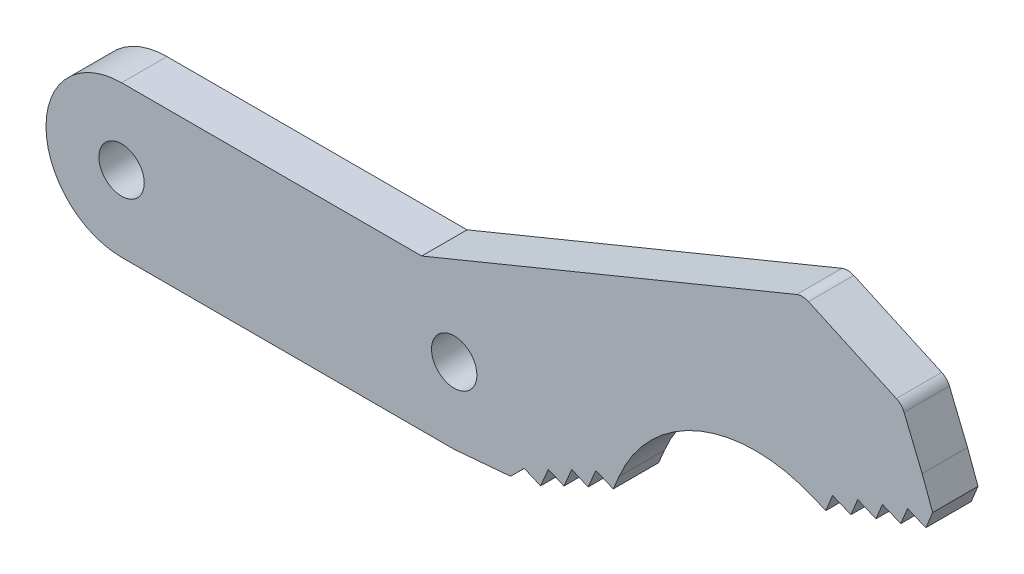
ISO-10303-21;
HEADER;
FILE_DESCRIPTION(('STEP AP214'),'2;1');
FILE_NAME('part.step','',(''),(''),'','','');
FILE_SCHEMA(('AUTOMOTIVE_DESIGN { 1 0 10303 214 1 1 1 1 }'));
ENDSEC;
DATA;
#1=APPLICATION_CONTEXT('core data for automotive mechanical design processes');
#2=APPLICATION_PROTOCOL_DEFINITION('international standard','automotive_design',2000,#1);
#3=PRODUCT_CONTEXT('',#1,'mechanical');
#4=PRODUCT('Part','Part','',(#3));
#5=PRODUCT_RELATED_PRODUCT_CATEGORY('part','',(#4));
#6=PRODUCT_DEFINITION_FORMATION('','',#4);
#7=PRODUCT_DEFINITION_CONTEXT('part definition',#1,'design');
#8=PRODUCT_DEFINITION('design','',#6,#7);
#9=PRODUCT_DEFINITION_SHAPE('','',#8);
#10=(LENGTH_UNIT() NAMED_UNIT(*) SI_UNIT(.MILLI.,.METRE.));
#11=(NAMED_UNIT(*) PLANE_ANGLE_UNIT() SI_UNIT($,.RADIAN.));
#12=(NAMED_UNIT(*) SI_UNIT($,.STERADIAN.) SOLID_ANGLE_UNIT());
#13=UNCERTAINTY_MEASURE_WITH_UNIT(LENGTH_MEASURE(1.E-05),#10,'distance_accuracy_value','');
#14=(GEOMETRIC_REPRESENTATION_CONTEXT(3) GLOBAL_UNCERTAINTY_ASSIGNED_CONTEXT((#13)) GLOBAL_UNIT_ASSIGNED_CONTEXT((#10,
#11,#12)) REPRESENTATION_CONTEXT('',''));
#15=CARTESIAN_POINT('',(0.,0.,0.));
#16=DIRECTION('',(0.,0.,1.));
#17=DIRECTION('',(1.,0.,0.));
#18=AXIS2_PLACEMENT_3D('',#15,#16,#17);
#19=CARTESIAN_POINT('',(0.,0.,3.));
#20=DIRECTION('',(0.,0.,1.));
#21=DIRECTION('',(1.,0.,0.));
#22=AXIS2_PLACEMENT_3D('',#19,#20,#21);
#23=PLANE('',#22);
#24=CARTESIAN_POINT('',(0.,0.,3.));
#25=DIRECTION('',(0.,0.,1.));
#26=DIRECTION('',(1.,0.,0.));
#27=AXIS2_PLACEMENT_3D('',#24,#25,#26);
#28=CIRCLE('',#27,1.5);
#29=CARTESIAN_POINT('',(1.5,0.,3.));
#30=VERTEX_POINT('',#29);
#31=EDGE_CURVE('E269',#30,#30,#28,.T.);
#32=ORIENTED_EDGE('',*,*,#31,.F.);
#33=EDGE_LOOP('',(#32));
#34=FACE_BOUND('',#33,.T.);
#35=CARTESIAN_POINT('',(0.,0.,3.));
#36=DIRECTION('',(0.,0.,1.));
#37=DIRECTION('',(1.,0.,0.));
#38=AXIS2_PLACEMENT_3D('',#35,#36,#37);
#39=CIRCLE('',#38,4.99999999999999);
#40=CARTESIAN_POINT('',(0.,4.99999999999997,3.));
#41=VERTEX_POINT('',#40);
#42=CARTESIAN_POINT('',(0.,-5.,3.));
#43=VERTEX_POINT('',#42);
#44=EDGE_CURVE('E324',#41,#43,#39,.T.);
#45=ORIENTED_EDGE('',*,*,#44,.T.);
#46=DIRECTION('',(1.,0.,0.));
#47=VECTOR('',#46,1.);
#48=CARTESIAN_POINT('',(0.,-5.,3.));
#49=LINE('',#48,#47);
#50=CARTESIAN_POINT('',(22.,-5.,3.));
#51=VERTEX_POINT('',#50);
#52=EDGE_CURVE('E162',#43,#51,#49,.T.);
#53=ORIENTED_EDGE('',*,*,#52,.T.);
#54=DIRECTION('',(0.996324640993903,0.0856575142551483,0.));
#55=VECTOR('',#54,1.);
#56=CARTESIAN_POINT('',(22.,-5.,3.));
#57=LINE('',#56,#55);
#58=CARTESIAN_POINT('',(25.729131342254,-4.67939353503313,3.));
#59=VERTEX_POINT('',#58);
#60=EDGE_CURVE('E405',#51,#59,#57,.T.);
#61=ORIENTED_EDGE('',*,*,#60,.T.);
#62=DIRECTION('',(0.705784062464387,0.708427030237601,0.));
#63=VECTOR('',#62,1.);
#64=CARTESIAN_POINT('',(26.629072935784,-3.77608190701817,3.));
#65=LINE('',#64,#63);
#66=CARTESIAN_POINT('',(26.629072935784,-3.77608190701817,3.));
#67=VERTEX_POINT('',#66);
#68=EDGE_CURVE('E424',#59,#67,#65,.T.);
#69=ORIENTED_EDGE('',*,*,#68,.T.);
#70=DIRECTION('',(0.920231847365872,-0.391373666837198,0.));
#71=VECTOR('',#70,1.);
#72=CARTESIAN_POINT('',(27.7149465156757,-4.23790283388607,3.));
#73=LINE('',#72,#71);
#74=CARTESIAN_POINT('',(27.7149465156757,-4.23790283388607,3.));
#75=VERTEX_POINT('',#74);
#76=EDGE_CURVE('E421',#67,#75,#73,.T.);
#77=ORIENTED_EDGE('',*,*,#76,.T.);
#78=DIRECTION('',(0.391373666837287,0.920231847365834,0.));
#79=VECTOR('',#78,1.);
#80=CARTESIAN_POINT('',(28.2279135207181,-3.03177014104923,3.));
#81=LINE('',#80,#79);
#82=CARTESIAN_POINT('',(28.2279135207181,-3.03177014104923,3.));
#83=VERTEX_POINT('',#82);
#84=EDGE_CURVE('E423',#75,#83,#81,.T.);
#85=ORIENTED_EDGE('',*,*,#84,.T.);
#86=DIRECTION('',(0.920231847365872,-0.391373666837198,0.));
#87=VECTOR('',#86,1.);
#88=CARTESIAN_POINT('',(29.2618659759202,-3.47150906650168,3.));
#89=LINE('',#88,#87);
#90=CARTESIAN_POINT('',(29.2618659759202,-3.47150906650168,3.));
#91=VERTEX_POINT('',#90);
#92=EDGE_CURVE('E426',#83,#91,#89,.T.);
#93=ORIENTED_EDGE('',*,*,#92,.T.);
#94=DIRECTION('',(0.391373666837196,0.920231847365873,0.));
#95=VECTOR('',#94,1.);
#96=CARTESIAN_POINT('',(29.7748329809625,-2.26537637366479,3.));
#97=LINE('',#96,#95);
#98=CARTESIAN_POINT('',(29.7748329809625,-2.26537637366479,3.));
#99=VERTEX_POINT('',#98);
#100=EDGE_CURVE('E432',#91,#99,#97,.T.);
#101=ORIENTED_EDGE('',*,*,#100,.T.);
#102=DIRECTION('',(0.920231847365872,-0.391373666837198,0.));
#103=VECTOR('',#102,1.);
#104=CARTESIAN_POINT('',(30.8607065608543,-2.72719730053268,3.));
#105=LINE('',#104,#103);
#106=CARTESIAN_POINT('',(30.8607065608543,-2.72719730053268,3.));
#107=VERTEX_POINT('',#106);
#108=EDGE_CURVE('E434',#99,#107,#105,.T.);
#109=ORIENTED_EDGE('',*,*,#108,.T.);
#110=DIRECTION('',(0.391373666837199,0.920231847365872,0.));
#111=VECTOR('',#110,1.);
#112=CARTESIAN_POINT('',(31.3736735658965,-1.52106460769579,3.));
#113=LINE('',#112,#111);
#114=CARTESIAN_POINT('',(31.3736735658965,-1.52106460769579,3.));
#115=VERTEX_POINT('',#114);
#116=EDGE_CURVE('E436',#107,#115,#113,.T.);
#117=ORIENTED_EDGE('',*,*,#116,.T.);
#118=DIRECTION('',(0.920231847365872,-0.391373666837197,0.));
#119=VECTOR('',#118,1.);
#120=CARTESIAN_POINT('',(32.5211185047678,-2.0090717707877,3.));
#121=LINE('',#120,#119);
#122=CARTESIAN_POINT('',(32.5211185047678,-2.0090717707877,3.));
#123=VERTEX_POINT('',#122);
#124=EDGE_CURVE('E438',#115,#123,#121,.T.);
#125=ORIENTED_EDGE('',*,*,#124,.T.);
#126=DIRECTION('',(0.391373666837194,0.920231847365874,0.));
#127=VECTOR('',#126,1.);
#128=CARTESIAN_POINT('',(32.5211185047678,-2.0090717707877,3.));
#129=LINE('',#128,#127);
#130=CARTESIAN_POINT('',(32.9075332749706,-1.10049971302301,3.));
#131=VERTEX_POINT('',#130);
#132=EDGE_CURVE('E440',#123,#131,#129,.T.);
#133=ORIENTED_EDGE('',*,*,#132,.T.);
#134=CARTESIAN_POINT('',(41.9365668236408,-4.9053841223708,3.));
#135=DIRECTION('',(0.,0.,-1.));
#136=DIRECTION('',(1.,0.,0.));
#137=AXIS2_PLACEMENT_3D('',#134,#135,#136);
#138=CIRCLE('',#137,9.79798919123255);
#139=CARTESIAN_POINT('',(45.7368226475957,4.12559854088391,3.));
#140=VERTEX_POINT('',#139);
#141=EDGE_CURVE('E442',#131,#140,#138,.T.);
#142=ORIENTED_EDGE('',*,*,#141,.T.);
#143=DIRECTION('',(0.925474403270303,-0.378810148876026,0.));
#144=VECTOR('',#143,1.);
#145=CARTESIAN_POINT('',(46.5817909078896,3.77974072855935,3.));
#146=LINE('',#145,#144);
#147=CARTESIAN_POINT('',(46.5817909078896,3.77974072855935,3.));
#148=VERTEX_POINT('',#147);
#149=EDGE_CURVE('E444',#140,#148,#146,.T.);
#150=ORIENTED_EDGE('',*,*,#149,.T.);
#151=DIRECTION('',(0.378810148876023,0.925474403270304,0.));
#152=VECTOR('',#151,1.);
#153=CARTESIAN_POINT('',(46.5817909078896,3.77974072855935,3.));
#154=LINE('',#153,#152);
#155=CARTESIAN_POINT('',(47.0287868835633,4.87180052441831,3.));
#156=VERTEX_POINT('',#155);
#157=EDGE_CURVE('E446',#148,#156,#154,.T.);
#158=ORIENTED_EDGE('',*,*,#157,.T.);
#159=DIRECTION('',(0.925474403270304,-0.378810148876023,0.));
#160=VECTOR('',#159,1.);
#161=CARTESIAN_POINT('',(47.0287868835633,4.87180052441831,3.));
#162=LINE('',#161,#160);
#163=CARTESIAN_POINT('',(48.2417909078896,4.37530031499215,3.));
#164=VERTEX_POINT('',#163);
#165=EDGE_CURVE('E448',#156,#164,#162,.T.);
#166=ORIENTED_EDGE('',*,*,#165,.T.);
#167=DIRECTION('',(0.378810148876023,0.925474403270304,0.));
#168=VECTOR('',#167,1.);
#169=CARTESIAN_POINT('',(48.2417909078896,4.37530031499215,3.));
#170=LINE('',#169,#168);
#171=CARTESIAN_POINT('',(48.6887868835633,5.4673601108511,3.));
#172=VERTEX_POINT('',#171);
#173=EDGE_CURVE('E450',#164,#172,#170,.T.);
#174=ORIENTED_EDGE('',*,*,#173,.T.);
#175=DIRECTION('',(0.925474403270304,-0.378810148876022,0.));
#176=VECTOR('',#175,1.);
#177=CARTESIAN_POINT('',(48.6887868835633,5.4673601108511,3.));
#178=LINE('',#177,#176);
#179=CARTESIAN_POINT('',(49.9017909078896,4.97085990142494,3.));
#180=VERTEX_POINT('',#179);
#181=EDGE_CURVE('E452',#172,#180,#178,.T.);
#182=ORIENTED_EDGE('',*,*,#181,.T.);
#183=DIRECTION('',(0.378810148876024,0.925474403270304,0.));
#184=VECTOR('',#183,1.);
#185=CARTESIAN_POINT('',(49.9017909078896,4.97085990142494,3.));
#186=LINE('',#185,#184);
#187=CARTESIAN_POINT('',(50.3274137382742,6.01070277822521,3.));
#188=VERTEX_POINT('',#187);
#189=EDGE_CURVE('E454',#180,#188,#186,.T.);
#190=ORIENTED_EDGE('',*,*,#189,.T.);
#191=DIRECTION('',(0.925474403270315,-0.378810148875997,0.));
#192=VECTOR('',#191,1.);
#193=CARTESIAN_POINT('',(50.3274137382742,6.01070277822521,3.));
#194=LINE('',#193,#192);
#195=CARTESIAN_POINT('',(51.5404177626005,5.51420256879908,3.));
#196=VERTEX_POINT('',#195);
#197=EDGE_CURVE('E456',#188,#196,#194,.T.);
#198=ORIENTED_EDGE('',*,*,#197,.T.);
#199=DIRECTION('',(0.378810148876024,0.925474403270304,0.));
#200=VECTOR('',#199,1.);
#201=CARTESIAN_POINT('',(51.5404177626005,5.51420256879908,3.));
#202=LINE('',#201,#200);
#203=CARTESIAN_POINT('',(51.9874137382742,6.60626236465803,3.));
#204=VERTEX_POINT('',#203);
#205=EDGE_CURVE('E458',#196,#204,#202,.T.);
#206=ORIENTED_EDGE('',*,*,#205,.T.);
#207=DIRECTION('',(0.925474403270325,-0.378810148875973,0.));
#208=VECTOR('',#207,1.);
#209=CARTESIAN_POINT('',(51.9874137382742,6.60626236465803,3.));
#210=LINE('',#209,#208);
#211=CARTESIAN_POINT('',(53.2004177626005,6.10976215523194,3.));
#212=VERTEX_POINT('',#211);
#213=EDGE_CURVE('E460',#204,#212,#210,.T.);
#214=ORIENTED_EDGE('',*,*,#213,.T.);
#215=DIRECTION('',(0.378810148875981,0.925474403270321,0.));
#216=VECTOR('',#215,1.);
#217=CARTESIAN_POINT('',(53.2004177626005,6.10976215523194,3.));
#218=LINE('',#217,#216);
#219=CARTESIAN_POINT('',(53.6474137382742,7.20182195109092,3.));
#220=VERTEX_POINT('',#219);
#221=EDGE_CURVE('E462',#212,#220,#218,.T.);
#222=ORIENTED_EDGE('',*,*,#221,.T.);
#223=DIRECTION('',(-0.344909177439844,0.938636063294912,0.));
#224=VECTOR('',#223,1.);
#225=CARTESIAN_POINT('',(53.6474137382742,7.20182195109092,3.));
#226=LINE('',#225,#224);
#227=CARTESIAN_POINT('',(52.954960556224,9.08626449808284,3.));
#228=VERTEX_POINT('',#227);
#229=EDGE_CURVE('E464',#220,#228,#226,.T.);
#230=ORIENTED_EDGE('',*,*,#229,.T.);
#231=DIRECTION('',(-0.380263412733203,0.924878228166551,0.));
#232=VECTOR('',#231,1.);
#233=CARTESIAN_POINT('',(51.7554288533698,12.0037704132359,3.));
#234=LINE('',#233,#232);
#235=CARTESIAN_POINT('',(51.7554288533698,12.0037704132359,3.));
#236=VERTEX_POINT('',#235);
#237=EDGE_CURVE('E466',#228,#236,#234,.T.);
#238=ORIENTED_EDGE('',*,*,#237,.T.);
#239=CARTESIAN_POINT('',(50.8305506252032,11.6235070005027,3.));
#240=DIRECTION('',(0.,0.,1.));
#241=DIRECTION('',(-1.,0.,0.));
#242=AXIS2_PLACEMENT_3D('',#239,#240,#241);
#243=CIRCLE('',#242,1.);
#244=CARTESIAN_POINT('',(51.2450850433417,12.5335406351441,3.));
#245=VERTEX_POINT('',#244);
#246=EDGE_CURVE('E468',#236,#245,#243,.T.);
#247=ORIENTED_EDGE('',*,*,#246,.T.);
#248=DIRECTION('',(-0.910033634641374,0.414534418138482,0.));
#249=VECTOR('',#248,1.);
#250=CARTESIAN_POINT('',(45.4378668595606,15.1788184789301,3.));
#251=LINE('',#250,#249);
#252=CARTESIAN_POINT('',(45.4378668595606,15.1788184789301,3.));
#253=VERTEX_POINT('',#252);
#254=EDGE_CURVE('E247',#245,#253,#251,.T.);
#255=ORIENTED_EDGE('',*,*,#254,.T.);
#256=CARTESIAN_POINT('',(45.0233324414221,14.2687848442887,3.));
#257=DIRECTION('',(0.,0.,1.));
#258=DIRECTION('',(-1.,0.,0.));
#259=AXIS2_PLACEMENT_3D('',#256,#257,#258);
#260=CIRCLE('',#259,1.);
#261=CARTESIAN_POINT('',(44.6430690286889,15.1936630724553,3.));
#262=VERTEX_POINT('',#261);
#263=EDGE_CURVE('E241',#253,#262,#260,.T.);
#264=ORIENTED_EDGE('',*,*,#263,.T.);
#265=DIRECTION('',(-0.924878228166549,-0.380263412733206,0.));
#266=VECTOR('',#265,1.);
#267=CARTESIAN_POINT('',(19.85,5.,3.));
#268=LINE('',#267,#266);
#269=CARTESIAN_POINT('',(19.85,5.,3.));
#270=VERTEX_POINT('',#269);
#271=EDGE_CURVE('E245',#262,#270,#268,.T.);
#272=ORIENTED_EDGE('',*,*,#271,.T.);
#273=DIRECTION('',(-1.,0.,0.));
#274=VECTOR('',#273,1.);
#275=CARTESIAN_POINT('',(0.,4.99999999999997,3.));
#276=LINE('',#275,#274);
#277=EDGE_CURVE('E53',#270,#41,#276,.T.);
#278=ORIENTED_EDGE('',*,*,#277,.T.);
#279=EDGE_LOOP('',(#45,#53,#61,#69,#77,#85,#93,#101,#109,#117,#125,#133,#142,#150,#158,#166,
#174,#182,#190,#198,#206,#214,#222,#230,#238,#247,#255,#264,#272,#278));
#280=FACE_BOUND('',#279,.T.);
#281=CARTESIAN_POINT('',(22.,0.,3.));
#282=DIRECTION('',(0.,0.,1.));
#283=DIRECTION('',(1.,0.,0.));
#284=AXIS2_PLACEMENT_3D('',#281,#282,#283);
#285=CIRCLE('',#284,1.5);
#286=CARTESIAN_POINT('',(23.5,0.,3.));
#287=VERTEX_POINT('',#286);
#288=EDGE_CURVE('E510',#287,#287,#285,.T.);
#289=ORIENTED_EDGE('',*,*,#288,.F.);
#290=EDGE_LOOP('',(#289));
#291=FACE_BOUND('',#290,.T.);
#292=ADVANCED_FACE('F36',(#34,#280,#291),#23,.T.);
#293=CARTESIAN_POINT('',(0.,0.,0.));
#294=DIRECTION('',(0.,0.,1.));
#295=DIRECTION('',(1.,0.,0.));
#296=AXIS2_PLACEMENT_3D('',#293,#294,#295);
#297=PLANE('',#296);
#298=CARTESIAN_POINT('',(0.,0.,0.));
#299=DIRECTION('',(0.,0.,1.));
#300=DIRECTION('',(1.,0.,0.));
#301=AXIS2_PLACEMENT_3D('',#298,#299,#300);
#302=CIRCLE('',#301,4.99999999999999);
#303=CARTESIAN_POINT('',(0.,4.99999999999997,0.));
#304=VERTEX_POINT('',#303);
#305=CARTESIAN_POINT('',(0.,-5.,0.));
#306=VERTEX_POINT('',#305);
#307=EDGE_CURVE('E265',#304,#306,#302,.T.);
#308=ORIENTED_EDGE('',*,*,#307,.F.);
#309=DIRECTION('',(-1.,0.,0.));
#310=VECTOR('',#309,1.);
#311=CARTESIAN_POINT('',(0.,4.99999999999997,0.));
#312=LINE('',#311,#310);
#313=CARTESIAN_POINT('',(19.85,5.,0.));
#314=VERTEX_POINT('',#313);
#315=EDGE_CURVE('E154',#314,#304,#312,.T.);
#316=ORIENTED_EDGE('',*,*,#315,.F.);
#317=DIRECTION('',(-0.924878228166549,-0.380263412733206,0.));
#318=VECTOR('',#317,1.);
#319=CARTESIAN_POINT('',(19.85,5.,0.));
#320=LINE('',#319,#318);
#321=CARTESIAN_POINT('',(44.6430690286889,15.1936630724553,0.));
#322=VERTEX_POINT('',#321);
#323=EDGE_CURVE('E148',#322,#314,#320,.T.);
#324=ORIENTED_EDGE('',*,*,#323,.F.);
#325=CARTESIAN_POINT('',(45.0233324414221,14.2687848442887,0.));
#326=DIRECTION('',(0.,0.,1.));
#327=DIRECTION('',(-1.,0.,0.));
#328=AXIS2_PLACEMENT_3D('',#325,#326,#327);
#329=CIRCLE('',#328,1.);
#330=CARTESIAN_POINT('',(45.4378668595606,15.1788184789301,0.));
#331=VERTEX_POINT('',#330);
#332=EDGE_CURVE('E255',#331,#322,#329,.T.);
#333=ORIENTED_EDGE('',*,*,#332,.F.);
#334=DIRECTION('',(-0.910033634641374,0.414534418138482,0.));
#335=VECTOR('',#334,1.);
#336=CARTESIAN_POINT('',(45.4378668595606,15.1788184789301,0.));
#337=LINE('',#336,#335);
#338=CARTESIAN_POINT('',(51.2450850433417,12.5335406351441,0.));
#339=VERTEX_POINT('',#338);
#340=EDGE_CURVE('E319',#339,#331,#337,.T.);
#341=ORIENTED_EDGE('',*,*,#340,.F.);
#342=CARTESIAN_POINT('',(50.8305506252032,11.6235070005027,0.));
#343=DIRECTION('',(0.,0.,1.));
#344=DIRECTION('',(-1.,0.,0.));
#345=AXIS2_PLACEMENT_3D('',#342,#343,#344);
#346=CIRCLE('',#345,1.);
#347=CARTESIAN_POINT('',(51.7554288533698,12.0037704132359,0.));
#348=VERTEX_POINT('',#347);
#349=EDGE_CURVE('E317',#348,#339,#346,.T.);
#350=ORIENTED_EDGE('',*,*,#349,.F.);
#351=DIRECTION('',(-0.380263412733203,0.924878228166551,0.));
#352=VECTOR('',#351,1.);
#353=CARTESIAN_POINT('',(51.7554288533698,12.0037704132359,0.));
#354=LINE('',#353,#352);
#355=CARTESIAN_POINT('',(52.954960556224,9.08626449808284,0.));
#356=VERTEX_POINT('',#355);
#357=EDGE_CURVE('E315',#356,#348,#354,.T.);
#358=ORIENTED_EDGE('',*,*,#357,.F.);
#359=DIRECTION('',(-0.344909177439844,0.938636063294912,0.));
#360=VECTOR('',#359,1.);
#361=CARTESIAN_POINT('',(53.6474137382742,7.20182195109092,0.));
#362=LINE('',#361,#360);
#363=CARTESIAN_POINT('',(53.6474137382742,7.20182195109092,0.));
#364=VERTEX_POINT('',#363);
#365=EDGE_CURVE('E313',#364,#356,#362,.T.);
#366=ORIENTED_EDGE('',*,*,#365,.F.);
#367=DIRECTION('',(0.378810148875981,0.925474403270321,0.));
#368=VECTOR('',#367,1.);
#369=CARTESIAN_POINT('',(53.2004177626005,6.10976215523194,0.));
#370=LINE('',#369,#368);
#371=CARTESIAN_POINT('',(53.2004177626005,6.10976215523194,0.));
#372=VERTEX_POINT('',#371);
#373=EDGE_CURVE('E311',#372,#364,#370,.T.);
#374=ORIENTED_EDGE('',*,*,#373,.F.);
#375=DIRECTION('',(0.925474403270325,-0.378810148875973,0.));
#376=VECTOR('',#375,1.);
#377=CARTESIAN_POINT('',(51.9874137382742,6.60626236465803,0.));
#378=LINE('',#377,#376);
#379=CARTESIAN_POINT('',(51.9874137382742,6.60626236465803,0.));
#380=VERTEX_POINT('',#379);
#381=EDGE_CURVE('E309',#380,#372,#378,.T.);
#382=ORIENTED_EDGE('',*,*,#381,.F.);
#383=DIRECTION('',(0.378810148876024,0.925474403270304,0.));
#384=VECTOR('',#383,1.);
#385=CARTESIAN_POINT('',(51.5404177626005,5.51420256879908,0.));
#386=LINE('',#385,#384);
#387=CARTESIAN_POINT('',(51.5404177626005,5.51420256879908,0.));
#388=VERTEX_POINT('',#387);
#389=EDGE_CURVE('E307',#388,#380,#386,.T.);
#390=ORIENTED_EDGE('',*,*,#389,.F.);
#391=DIRECTION('',(0.925474403270315,-0.378810148875997,0.));
#392=VECTOR('',#391,1.);
#393=CARTESIAN_POINT('',(50.3274137382742,6.01070277822521,0.));
#394=LINE('',#393,#392);
#395=CARTESIAN_POINT('',(50.3274137382742,6.01070277822521,0.));
#396=VERTEX_POINT('',#395);
#397=EDGE_CURVE('E305',#396,#388,#394,.T.);
#398=ORIENTED_EDGE('',*,*,#397,.F.);
#399=DIRECTION('',(0.378810148876024,0.925474403270304,0.));
#400=VECTOR('',#399,1.);
#401=CARTESIAN_POINT('',(49.9017909078896,4.97085990142494,0.));
#402=LINE('',#401,#400);
#403=CARTESIAN_POINT('',(49.9017909078896,4.97085990142494,0.));
#404=VERTEX_POINT('',#403);
#405=EDGE_CURVE('E303',#404,#396,#402,.T.);
#406=ORIENTED_EDGE('',*,*,#405,.F.);
#407=DIRECTION('',(0.925474403270304,-0.378810148876022,0.));
#408=VECTOR('',#407,1.);
#409=CARTESIAN_POINT('',(48.6887868835633,5.4673601108511,0.));
#410=LINE('',#409,#408);
#411=CARTESIAN_POINT('',(48.6887868835633,5.4673601108511,0.));
#412=VERTEX_POINT('',#411);
#413=EDGE_CURVE('E301',#412,#404,#410,.T.);
#414=ORIENTED_EDGE('',*,*,#413,.F.);
#415=DIRECTION('',(0.378810148876023,0.925474403270304,0.));
#416=VECTOR('',#415,1.);
#417=CARTESIAN_POINT('',(48.2417909078896,4.37530031499215,0.));
#418=LINE('',#417,#416);
#419=CARTESIAN_POINT('',(48.2417909078896,4.37530031499215,0.));
#420=VERTEX_POINT('',#419);
#421=EDGE_CURVE('E299',#420,#412,#418,.T.);
#422=ORIENTED_EDGE('',*,*,#421,.F.);
#423=DIRECTION('',(0.925474403270304,-0.378810148876023,0.));
#424=VECTOR('',#423,1.);
#425=CARTESIAN_POINT('',(47.0287868835633,4.87180052441831,0.));
#426=LINE('',#425,#424);
#427=CARTESIAN_POINT('',(47.0287868835633,4.87180052441831,0.));
#428=VERTEX_POINT('',#427);
#429=EDGE_CURVE('E297',#428,#420,#426,.T.);
#430=ORIENTED_EDGE('',*,*,#429,.F.);
#431=DIRECTION('',(0.378810148876023,0.925474403270304,0.));
#432=VECTOR('',#431,1.);
#433=CARTESIAN_POINT('',(46.5817909078896,3.77974072855935,0.));
#434=LINE('',#433,#432);
#435=CARTESIAN_POINT('',(46.5817909078896,3.77974072855935,0.));
#436=VERTEX_POINT('',#435);
#437=EDGE_CURVE('E295',#436,#428,#434,.T.);
#438=ORIENTED_EDGE('',*,*,#437,.F.);
#439=DIRECTION('',(0.925474403270303,-0.378810148876026,0.));
#440=VECTOR('',#439,1.);
#441=CARTESIAN_POINT('',(46.5817909078896,3.77974072855935,0.));
#442=LINE('',#441,#440);
#443=CARTESIAN_POINT('',(45.7368226475957,4.12559854088391,0.));
#444=VERTEX_POINT('',#443);
#445=EDGE_CURVE('E293',#444,#436,#442,.T.);
#446=ORIENTED_EDGE('',*,*,#445,.F.);
#447=CARTESIAN_POINT('',(41.9365668236408,-4.9053841223708,0.));
#448=DIRECTION('',(0.,0.,-1.));
#449=DIRECTION('',(1.,0.,0.));
#450=AXIS2_PLACEMENT_3D('',#447,#448,#449);
#451=CIRCLE('',#450,9.79798919123255);
#452=CARTESIAN_POINT('',(32.9075332749706,-1.10049971302301,0.));
#453=VERTEX_POINT('',#452);
#454=EDGE_CURVE('E291',#453,#444,#451,.T.);
#455=ORIENTED_EDGE('',*,*,#454,.F.);
#456=DIRECTION('',(0.391373666837194,0.920231847365874,0.));
#457=VECTOR('',#456,1.);
#458=CARTESIAN_POINT('',(32.5211185047678,-2.0090717707877,0.));
#459=LINE('',#458,#457);
#460=CARTESIAN_POINT('',(32.5211185047678,-2.0090717707877,0.));
#461=VERTEX_POINT('',#460);
#462=EDGE_CURVE('E289',#461,#453,#459,.T.);
#463=ORIENTED_EDGE('',*,*,#462,.F.);
#464=DIRECTION('',(0.920231847365872,-0.391373666837197,0.));
#465=VECTOR('',#464,1.);
#466=CARTESIAN_POINT('',(32.5211185047678,-2.0090717707877,0.));
#467=LINE('',#466,#465);
#468=CARTESIAN_POINT('',(31.3736735658965,-1.52106460769579,0.));
#469=VERTEX_POINT('',#468);
#470=EDGE_CURVE('E287',#469,#461,#467,.T.);
#471=ORIENTED_EDGE('',*,*,#470,.F.);
#472=DIRECTION('',(0.391373666837199,0.920231847365872,0.));
#473=VECTOR('',#472,1.);
#474=CARTESIAN_POINT('',(31.3736735658965,-1.52106460769579,0.));
#475=LINE('',#474,#473);
#476=CARTESIAN_POINT('',(30.8607065608543,-2.72719730053268,0.));
#477=VERTEX_POINT('',#476);
#478=EDGE_CURVE('E285',#477,#469,#475,.T.);
#479=ORIENTED_EDGE('',*,*,#478,.F.);
#480=DIRECTION('',(0.920231847365872,-0.391373666837198,0.));
#481=VECTOR('',#480,1.);
#482=CARTESIAN_POINT('',(30.8607065608543,-2.72719730053268,0.));
#483=LINE('',#482,#481);
#484=CARTESIAN_POINT('',(29.7748329809625,-2.26537637366479,0.));
#485=VERTEX_POINT('',#484);
#486=EDGE_CURVE('E283',#485,#477,#483,.T.);
#487=ORIENTED_EDGE('',*,*,#486,.F.);
#488=DIRECTION('',(0.391373666837196,0.920231847365873,0.));
#489=VECTOR('',#488,1.);
#490=CARTESIAN_POINT('',(29.7748329809625,-2.26537637366479,0.));
#491=LINE('',#490,#489);
#492=CARTESIAN_POINT('',(29.2618659759202,-3.47150906650168,0.));
#493=VERTEX_POINT('',#492);
#494=EDGE_CURVE('E281',#493,#485,#491,.T.);
#495=ORIENTED_EDGE('',*,*,#494,.F.);
#496=DIRECTION('',(0.920231847365872,-0.391373666837198,0.));
#497=VECTOR('',#496,1.);
#498=CARTESIAN_POINT('',(29.2618659759202,-3.47150906650168,0.));
#499=LINE('',#498,#497);
#500=CARTESIAN_POINT('',(28.2279135207181,-3.03177014104923,0.));
#501=VERTEX_POINT('',#500);
#502=EDGE_CURVE('E279',#501,#493,#499,.T.);
#503=ORIENTED_EDGE('',*,*,#502,.F.);
#504=DIRECTION('',(0.391373666837287,0.920231847365834,0.));
#505=VECTOR('',#504,1.);
#506=CARTESIAN_POINT('',(28.2279135207181,-3.03177014104923,0.));
#507=LINE('',#506,#505);
#508=CARTESIAN_POINT('',(27.7149465156757,-4.23790283388607,0.));
#509=VERTEX_POINT('',#508);
#510=EDGE_CURVE('E277',#509,#501,#507,.T.);
#511=ORIENTED_EDGE('',*,*,#510,.F.);
#512=DIRECTION('',(0.920231847365872,-0.391373666837198,0.));
#513=VECTOR('',#512,1.);
#514=CARTESIAN_POINT('',(27.7149465156757,-4.23790283388607,0.));
#515=LINE('',#514,#513);
#516=CARTESIAN_POINT('',(26.629072935784,-3.77608190701817,0.));
#517=VERTEX_POINT('',#516);
#518=EDGE_CURVE('E275',#517,#509,#515,.T.);
#519=ORIENTED_EDGE('',*,*,#518,.F.);
#520=DIRECTION('',(0.705784062464387,0.708427030237601,0.));
#521=VECTOR('',#520,1.);
#522=CARTESIAN_POINT('',(26.629072935784,-3.77608190701817,0.));
#523=LINE('',#522,#521);
#524=CARTESIAN_POINT('',(25.729131342254,-4.67939353503313,0.));
#525=VERTEX_POINT('',#524);
#526=EDGE_CURVE('E273',#525,#517,#523,.T.);
#527=ORIENTED_EDGE('',*,*,#526,.F.);
#528=DIRECTION('',(0.996324640993903,0.0856575142551483,0.));
#529=VECTOR('',#528,1.);
#530=CARTESIAN_POINT('',(22.,-5.,0.));
#531=LINE('',#530,#529);
#532=CARTESIAN_POINT('',(22.,-5.,0.));
#533=VERTEX_POINT('',#532);
#534=EDGE_CURVE('E271',#533,#525,#531,.T.);
#535=ORIENTED_EDGE('',*,*,#534,.F.);
#536=DIRECTION('',(1.,0.,0.));
#537=VECTOR('',#536,1.);
#538=CARTESIAN_POINT('',(0.,-5.,0.));
#539=LINE('',#538,#537);
#540=EDGE_CURVE('E268',#306,#533,#539,.T.);
#541=ORIENTED_EDGE('',*,*,#540,.F.);
#542=EDGE_LOOP('',(#308,#316,#324,#333,#341,#350,#358,#366,#374,#382,#390,#398,#406,#414,#422,
#430,#438,#446,#455,#463,#471,#479,#487,#495,#503,#511,#519,#527,#535,#541));
#543=FACE_BOUND('',#542,.T.);
#544=CARTESIAN_POINT('',(0.,0.,0.));
#545=DIRECTION('',(0.,0.,1.));
#546=DIRECTION('',(1.,0.,0.));
#547=AXIS2_PLACEMENT_3D('',#544,#545,#546);
#548=CIRCLE('',#547,1.5);
#549=CARTESIAN_POINT('',(1.5,0.,0.));
#550=VERTEX_POINT('',#549);
#551=EDGE_CURVE('E516',#550,#550,#548,.T.);
#552=ORIENTED_EDGE('',*,*,#551,.T.);
#553=EDGE_LOOP('',(#552));
#554=FACE_BOUND('',#553,.T.);
#555=CARTESIAN_POINT('',(22.,0.,0.));
#556=DIRECTION('',(0.,0.,1.));
#557=DIRECTION('',(1.,0.,0.));
#558=AXIS2_PLACEMENT_3D('',#555,#556,#557);
#559=CIRCLE('',#558,1.5);
#560=CARTESIAN_POINT('',(23.5,0.,0.));
#561=VERTEX_POINT('',#560);
#562=EDGE_CURVE('E513',#561,#561,#559,.T.);
#563=ORIENTED_EDGE('',*,*,#562,.T.);
#564=EDGE_LOOP('',(#563));
#565=FACE_BOUND('',#564,.T.);
#566=ADVANCED_FACE('F409',(#543,#554,#565),#297,.F.);
#567=CARTESIAN_POINT('',(0.,0.,3.));
#568=DIRECTION('',(0.,0.,-1.));
#569=DIRECTION('',(-1.,0.,0.));
#570=AXIS2_PLACEMENT_3D('',#567,#568,#569);
#571=CYLINDRICAL_SURFACE('',#570,4.99999999999999);
#572=ORIENTED_EDGE('',*,*,#307,.T.);
#573=DIRECTION('',(0.,0.,-1.));
#574=VECTOR('',#573,1.);
#575=CARTESIAN_POINT('',(0.,-5.,3.));
#576=LINE('',#575,#574);
#577=EDGE_CURVE('E11',#43,#306,#576,.T.);
#578=ORIENTED_EDGE('',*,*,#577,.F.);
#579=ORIENTED_EDGE('',*,*,#44,.F.);
#580=DIRECTION('',(0.,0.,-1.));
#581=VECTOR('',#580,1.);
#582=CARTESIAN_POINT('',(0.,4.99999999999997,3.));
#583=LINE('',#582,#581);
#584=EDGE_CURVE('E261',#41,#304,#583,.T.);
#585=ORIENTED_EDGE('',*,*,#584,.T.);
#586=EDGE_LOOP('',(#572,#578,#579,#585));
#587=FACE_BOUND('',#586,.T.);
#588=ADVANCED_FACE('F38',(#587),#571,.T.);
#589=CARTESIAN_POINT('',(0.,-5.,3.));
#590=DIRECTION('',(0.,1.,0.));
#591=DIRECTION('',(-1.,0.,0.));
#592=AXIS2_PLACEMENT_3D('',#589,#590,#591);
#593=PLANE('',#592);
#594=ORIENTED_EDGE('',*,*,#540,.T.);
#595=DIRECTION('',(0.,0.,-1.));
#596=VECTOR('',#595,1.);
#597=CARTESIAN_POINT('',(22.,-5.,3.));
#598=LINE('',#597,#596);
#599=EDGE_CURVE('E45',#51,#533,#598,.T.);
#600=ORIENTED_EDGE('',*,*,#599,.F.);
#601=ORIENTED_EDGE('',*,*,#52,.F.);
#602=ORIENTED_EDGE('',*,*,#577,.T.);
#603=EDGE_LOOP('',(#594,#600,#601,#602));
#604=FACE_BOUND('',#603,.T.);
#605=ADVANCED_FACE('F789',(#604),#593,.F.);
#606=CARTESIAN_POINT('',(22.,-5.,3.));
#607=DIRECTION('',(-0.0856575142551483,0.996324640993903,0.));
#608=DIRECTION('',(-0.996324640993903,-0.0856575142551483,0.));
#609=AXIS2_PLACEMENT_3D('',#606,#607,#608);
#610=PLANE('',#609);
#611=ORIENTED_EDGE('',*,*,#534,.T.);
#612=DIRECTION('',(0.,0.,-1.));
#613=VECTOR('',#612,1.);
#614=CARTESIAN_POINT('',(25.729131342254,-4.67939353503313,3.));
#615=LINE('',#614,#613);
#616=EDGE_CURVE('E397',#59,#525,#615,.T.);
#617=ORIENTED_EDGE('',*,*,#616,.F.);
#618=ORIENTED_EDGE('',*,*,#60,.F.);
#619=ORIENTED_EDGE('',*,*,#599,.T.);
#620=EDGE_LOOP('',(#611,#617,#618,#619));
#621=FACE_BOUND('',#620,.T.);
#622=ADVANCED_FACE('F403',(#621),#610,.F.);
#623=CARTESIAN_POINT('',(26.629072935784,-3.77608190701817,3.));
#624=DIRECTION('',(-0.708427030237601,0.705784062464387,0.));
#625=DIRECTION('',(-0.705784062464387,-0.708427030237601,0.));
#626=AXIS2_PLACEMENT_3D('',#623,#624,#625);
#627=PLANE('',#626);
#628=ORIENTED_EDGE('',*,*,#526,.T.);
#629=DIRECTION('',(0.,0.,-1.));
#630=VECTOR('',#629,1.);
#631=CARTESIAN_POINT('',(26.629072935784,-3.77608190701817,3.));
#632=LINE('',#631,#630);
#633=EDGE_CURVE('E394',#67,#517,#632,.T.);
#634=ORIENTED_EDGE('',*,*,#633,.F.);
#635=ORIENTED_EDGE('',*,*,#68,.F.);
#636=ORIENTED_EDGE('',*,*,#616,.T.);
#637=EDGE_LOOP('',(#628,#634,#635,#636));
#638=FACE_BOUND('',#637,.T.);
#639=ADVANCED_FACE('F415',(#638),#627,.F.);
#640=CARTESIAN_POINT('',(27.7149465156757,-4.23790283388607,3.));
#641=DIRECTION('',(0.391373666837198,0.920231847365872,0.));
#642=DIRECTION('',(-0.920231847365872,0.391373666837198,0.));
#643=AXIS2_PLACEMENT_3D('',#640,#641,#642);
#644=PLANE('',#643);
#645=ORIENTED_EDGE('',*,*,#518,.T.);
#646=DIRECTION('',(0.,0.,-1.));
#647=VECTOR('',#646,1.);
#648=CARTESIAN_POINT('',(27.7149465156757,-4.23790283388607,3.));
#649=LINE('',#648,#647);
#650=EDGE_CURVE('E391',#75,#509,#649,.T.);
#651=ORIENTED_EDGE('',*,*,#650,.F.);
#652=ORIENTED_EDGE('',*,*,#76,.F.);
#653=ORIENTED_EDGE('',*,*,#633,.T.);
#654=EDGE_LOOP('',(#645,#651,#652,#653));
#655=FACE_BOUND('',#654,.T.);
#656=ADVANCED_FACE('F419',(#655),#644,.F.);
#657=CARTESIAN_POINT('',(28.2279135207181,-3.03177014104923,3.));
#658=DIRECTION('',(-0.920231847365834,0.391373666837287,0.));
#659=DIRECTION('',(-0.391373666837287,-0.920231847365834,0.));
#660=AXIS2_PLACEMENT_3D('',#657,#658,#659);
#661=PLANE('',#660);
#662=ORIENTED_EDGE('',*,*,#510,.T.);
#663=DIRECTION('',(0.,0.,-1.));
#664=VECTOR('',#663,1.);
#665=CARTESIAN_POINT('',(28.2279135207181,-3.03177014104923,3.));
#666=LINE('',#665,#664);
#667=EDGE_CURVE('E388',#83,#501,#666,.T.);
#668=ORIENTED_EDGE('',*,*,#667,.F.);
#669=ORIENTED_EDGE('',*,*,#84,.F.);
#670=ORIENTED_EDGE('',*,*,#650,.T.);
#671=EDGE_LOOP('',(#662,#668,#669,#670));
#672=FACE_BOUND('',#671,.T.);
#673=ADVANCED_FACE('F754',(#672),#661,.F.);
#674=CARTESIAN_POINT('',(29.2618659759202,-3.47150906650168,3.));
#675=DIRECTION('',(0.391373666837198,0.920231847365872,0.));
#676=DIRECTION('',(-0.920231847365872,0.391373666837198,0.));
#677=AXIS2_PLACEMENT_3D('',#674,#675,#676);
#678=PLANE('',#677);
#679=ORIENTED_EDGE('',*,*,#502,.T.);
#680=DIRECTION('',(0.,0.,-1.));
#681=VECTOR('',#680,1.);
#682=CARTESIAN_POINT('',(29.2618659759202,-3.47150906650168,3.));
#683=LINE('',#682,#681);
#684=EDGE_CURVE('E385',#91,#493,#683,.T.);
#685=ORIENTED_EDGE('',*,*,#684,.F.);
#686=ORIENTED_EDGE('',*,*,#92,.F.);
#687=ORIENTED_EDGE('',*,*,#667,.T.);
#688=EDGE_LOOP('',(#679,#685,#686,#687));
#689=FACE_BOUND('',#688,.T.);
#690=ADVANCED_FACE('F744',(#689),#678,.F.);
#691=CARTESIAN_POINT('',(29.7748329809625,-2.26537637366479,3.));
#692=DIRECTION('',(-0.920231847365873,0.391373666837196,0.));
#693=DIRECTION('',(-0.391373666837196,-0.920231847365873,0.));
#694=AXIS2_PLACEMENT_3D('',#691,#692,#693);
#695=PLANE('',#694);
#696=ORIENTED_EDGE('',*,*,#494,.T.);
#697=DIRECTION('',(0.,0.,-1.));
#698=VECTOR('',#697,1.);
#699=CARTESIAN_POINT('',(29.7748329809625,-2.26537637366479,3.));
#700=LINE('',#699,#698);
#701=EDGE_CURVE('E382',#99,#485,#700,.T.);
#702=ORIENTED_EDGE('',*,*,#701,.F.);
#703=ORIENTED_EDGE('',*,*,#100,.F.);
#704=ORIENTED_EDGE('',*,*,#684,.T.);
#705=EDGE_LOOP('',(#696,#702,#703,#704));
#706=FACE_BOUND('',#705,.T.);
#707=ADVANCED_FACE('F734',(#706),#695,.F.);
#708=CARTESIAN_POINT('',(30.8607065608543,-2.72719730053268,3.));
#709=DIRECTION('',(0.391373666837198,0.920231847365872,0.));
#710=DIRECTION('',(-0.920231847365872,0.391373666837198,0.));
#711=AXIS2_PLACEMENT_3D('',#708,#709,#710);
#712=PLANE('',#711);
#713=ORIENTED_EDGE('',*,*,#486,.T.);
#714=DIRECTION('',(0.,0.,-1.));
#715=VECTOR('',#714,1.);
#716=CARTESIAN_POINT('',(30.8607065608543,-2.72719730053268,3.));
#717=LINE('',#716,#715);
#718=EDGE_CURVE('E379',#107,#477,#717,.T.);
#719=ORIENTED_EDGE('',*,*,#718,.F.);
#720=ORIENTED_EDGE('',*,*,#108,.F.);
#721=ORIENTED_EDGE('',*,*,#701,.T.);
#722=EDGE_LOOP('',(#713,#719,#720,#721));
#723=FACE_BOUND('',#722,.T.);
#724=ADVANCED_FACE('F724',(#723),#712,.F.);
#725=CARTESIAN_POINT('',(31.3736735658965,-1.52106460769579,3.));
#726=DIRECTION('',(-0.920231847365872,0.391373666837199,0.));
#727=DIRECTION('',(-0.391373666837199,-0.920231847365872,0.));
#728=AXIS2_PLACEMENT_3D('',#725,#726,#727);
#729=PLANE('',#728);
#730=ORIENTED_EDGE('',*,*,#478,.T.);
#731=DIRECTION('',(0.,0.,-1.));
#732=VECTOR('',#731,1.);
#733=CARTESIAN_POINT('',(31.3736735658965,-1.52106460769579,3.));
#734=LINE('',#733,#732);
#735=EDGE_CURVE('E376',#115,#469,#734,.T.);
#736=ORIENTED_EDGE('',*,*,#735,.F.);
#737=ORIENTED_EDGE('',*,*,#116,.F.);
#738=ORIENTED_EDGE('',*,*,#718,.T.);
#739=EDGE_LOOP('',(#730,#736,#737,#738));
#740=FACE_BOUND('',#739,.T.);
#741=ADVANCED_FACE('F714',(#740),#729,.F.);
#742=CARTESIAN_POINT('',(32.5211185047678,-2.0090717707877,3.));
#743=DIRECTION('',(0.391373666837197,0.920231847365872,0.));
#744=DIRECTION('',(-0.920231847365873,0.391373666837198,0.));
#745=AXIS2_PLACEMENT_3D('',#742,#743,#744);
#746=PLANE('',#745);
#747=ORIENTED_EDGE('',*,*,#470,.T.);
#748=DIRECTION('',(0.,0.,-1.));
#749=VECTOR('',#748,1.);
#750=CARTESIAN_POINT('',(32.5211185047678,-2.0090717707877,3.));
#751=LINE('',#750,#749);
#752=EDGE_CURVE('E373',#123,#461,#751,.T.);
#753=ORIENTED_EDGE('',*,*,#752,.F.);
#754=ORIENTED_EDGE('',*,*,#124,.F.);
#755=ORIENTED_EDGE('',*,*,#735,.T.);
#756=EDGE_LOOP('',(#747,#753,#754,#755));
#757=FACE_BOUND('',#756,.T.);
#758=ADVANCED_FACE('F704',(#757),#746,.F.);
#759=CARTESIAN_POINT('',(32.5211185047678,-2.0090717707877,3.));
#760=DIRECTION('',(-0.920231847365874,0.391373666837195,0.));
#761=DIRECTION('',(-0.391373666837195,-0.920231847365874,0.));
#762=AXIS2_PLACEMENT_3D('',#759,#760,#761);
#763=PLANE('',#762);
#764=ORIENTED_EDGE('',*,*,#462,.T.);
#765=DIRECTION('',(0.,0.,-1.));
#766=VECTOR('',#765,1.);
#767=CARTESIAN_POINT('',(32.9075332749706,-1.10049971302301,3.));
#768=LINE('',#767,#766);
#769=EDGE_CURVE('E370',#131,#453,#768,.T.);
#770=ORIENTED_EDGE('',*,*,#769,.F.);
#771=ORIENTED_EDGE('',*,*,#132,.F.);
#772=ORIENTED_EDGE('',*,*,#752,.T.);
#773=EDGE_LOOP('',(#764,#770,#771,#772));
#774=FACE_BOUND('',#773,.T.);
#775=ADVANCED_FACE('F694',(#774),#763,.F.);
#776=CARTESIAN_POINT('',(41.9365668236408,-4.9053841223708,3.));
#777=DIRECTION('',(0.,0.,-1.));
#778=DIRECTION('',(-1.,0.,0.));
#779=AXIS2_PLACEMENT_3D('',#776,#777,#778);
#780=CYLINDRICAL_SURFACE('',#779,9.79798919123255);
#781=ORIENTED_EDGE('',*,*,#454,.T.);
#782=DIRECTION('',(0.,0.,-1.));
#783=VECTOR('',#782,1.);
#784=CARTESIAN_POINT('',(45.7368226475957,4.12559854088391,3.));
#785=LINE('',#784,#783);
#786=EDGE_CURVE('E367',#140,#444,#785,.T.);
#787=ORIENTED_EDGE('',*,*,#786,.F.);
#788=ORIENTED_EDGE('',*,*,#141,.F.);
#789=ORIENTED_EDGE('',*,*,#769,.T.);
#790=EDGE_LOOP('',(#781,#787,#788,#789));
#791=FACE_BOUND('',#790,.T.);
#792=ADVANCED_FACE('F684',(#791),#780,.F.);
#793=CARTESIAN_POINT('',(46.5817909078896,3.77974072855935,3.));
#794=DIRECTION('',(0.378810148876026,0.925474403270303,0.));
#795=DIRECTION('',(-0.925474403270303,0.378810148876026,0.));
#796=AXIS2_PLACEMENT_3D('',#793,#794,#795);
#797=PLANE('',#796);
#798=ORIENTED_EDGE('',*,*,#445,.T.);
#799=DIRECTION('',(0.,0.,-1.));
#800=VECTOR('',#799,1.);
#801=CARTESIAN_POINT('',(46.5817909078896,3.77974072855935,3.));
#802=LINE('',#801,#800);
#803=EDGE_CURVE('E364',#148,#436,#802,.T.);
#804=ORIENTED_EDGE('',*,*,#803,.F.);
#805=ORIENTED_EDGE('',*,*,#149,.F.);
#806=ORIENTED_EDGE('',*,*,#786,.T.);
#807=EDGE_LOOP('',(#798,#804,#805,#806));
#808=FACE_BOUND('',#807,.T.);
#809=ADVANCED_FACE('F674',(#808),#797,.F.);
#810=CARTESIAN_POINT('',(46.5817909078896,3.77974072855935,3.));
#811=DIRECTION('',(-0.925474403270304,0.378810148876023,0.));
#812=DIRECTION('',(-0.378810148876023,-0.925474403270304,0.));
#813=AXIS2_PLACEMENT_3D('',#810,#811,#812);
#814=PLANE('',#813);
#815=ORIENTED_EDGE('',*,*,#437,.T.);
#816=DIRECTION('',(0.,0.,-1.));
#817=VECTOR('',#816,1.);
#818=CARTESIAN_POINT('',(47.0287868835633,4.87180052441831,3.));
#819=LINE('',#818,#817);
#820=EDGE_CURVE('E361',#156,#428,#819,.T.);
#821=ORIENTED_EDGE('',*,*,#820,.F.);
#822=ORIENTED_EDGE('',*,*,#157,.F.);
#823=ORIENTED_EDGE('',*,*,#803,.T.);
#824=EDGE_LOOP('',(#815,#821,#822,#823));
#825=FACE_BOUND('',#824,.T.);
#826=ADVANCED_FACE('F664',(#825),#814,.F.);
#827=CARTESIAN_POINT('',(47.0287868835633,4.87180052441831,3.));
#828=DIRECTION('',(0.378810148876023,0.925474403270304,0.));
#829=DIRECTION('',(-0.925474403270304,0.378810148876023,0.));
#830=AXIS2_PLACEMENT_3D('',#827,#828,#829);
#831=PLANE('',#830);
#832=ORIENTED_EDGE('',*,*,#429,.T.);
#833=DIRECTION('',(0.,0.,-1.));
#834=VECTOR('',#833,1.);
#835=CARTESIAN_POINT('',(48.2417909078896,4.37530031499215,3.));
#836=LINE('',#835,#834);
#837=EDGE_CURVE('E358',#164,#420,#836,.T.);
#838=ORIENTED_EDGE('',*,*,#837,.F.);
#839=ORIENTED_EDGE('',*,*,#165,.F.);
#840=ORIENTED_EDGE('',*,*,#820,.T.);
#841=EDGE_LOOP('',(#832,#838,#839,#840));
#842=FACE_BOUND('',#841,.T.);
#843=ADVANCED_FACE('F654',(#842),#831,.F.);
#844=CARTESIAN_POINT('',(48.2417909078896,4.37530031499215,3.));
#845=DIRECTION('',(-0.925474403270304,0.378810148876023,0.));
#846=DIRECTION('',(-0.378810148876023,-0.925474403270304,0.));
#847=AXIS2_PLACEMENT_3D('',#844,#845,#846);
#848=PLANE('',#847);
#849=ORIENTED_EDGE('',*,*,#421,.T.);
#850=DIRECTION('',(0.,0.,-1.));
#851=VECTOR('',#850,1.);
#852=CARTESIAN_POINT('',(48.6887868835633,5.4673601108511,3.));
#853=LINE('',#852,#851);
#854=EDGE_CURVE('E355',#172,#412,#853,.T.);
#855=ORIENTED_EDGE('',*,*,#854,.F.);
#856=ORIENTED_EDGE('',*,*,#173,.F.);
#857=ORIENTED_EDGE('',*,*,#837,.T.);
#858=EDGE_LOOP('',(#849,#855,#856,#857));
#859=FACE_BOUND('',#858,.T.);
#860=ADVANCED_FACE('F644',(#859),#848,.F.);
#861=CARTESIAN_POINT('',(48.6887868835633,5.4673601108511,3.));
#862=DIRECTION('',(0.378810148876022,0.925474403270305,0.));
#863=DIRECTION('',(-0.925474403270305,0.378810148876022,0.));
#864=AXIS2_PLACEMENT_3D('',#861,#862,#863);
#865=PLANE('',#864);
#866=ORIENTED_EDGE('',*,*,#413,.T.);
#867=DIRECTION('',(0.,0.,-1.));
#868=VECTOR('',#867,1.);
#869=CARTESIAN_POINT('',(49.9017909078896,4.97085990142494,3.));
#870=LINE('',#869,#868);
#871=EDGE_CURVE('E352',#180,#404,#870,.T.);
#872=ORIENTED_EDGE('',*,*,#871,.F.);
#873=ORIENTED_EDGE('',*,*,#181,.F.);
#874=ORIENTED_EDGE('',*,*,#854,.T.);
#875=EDGE_LOOP('',(#866,#872,#873,#874));
#876=FACE_BOUND('',#875,.T.);
#877=ADVANCED_FACE('F634',(#876),#865,.F.);
#878=CARTESIAN_POINT('',(49.9017909078896,4.97085990142494,3.));
#879=DIRECTION('',(-0.925474403270303,0.378810148876024,0.));
#880=DIRECTION('',(-0.378810148876024,-0.925474403270304,0.));
#881=AXIS2_PLACEMENT_3D('',#878,#879,#880);
#882=PLANE('',#881);
#883=ORIENTED_EDGE('',*,*,#405,.T.);
#884=DIRECTION('',(0.,0.,-1.));
#885=VECTOR('',#884,1.);
#886=CARTESIAN_POINT('',(50.3274137382742,6.01070277822521,3.));
#887=LINE('',#886,#885);
#888=EDGE_CURVE('E349',#188,#396,#887,.T.);
#889=ORIENTED_EDGE('',*,*,#888,.F.);
#890=ORIENTED_EDGE('',*,*,#189,.F.);
#891=ORIENTED_EDGE('',*,*,#871,.T.);
#892=EDGE_LOOP('',(#883,#889,#890,#891));
#893=FACE_BOUND('',#892,.T.);
#894=ADVANCED_FACE('F624',(#893),#882,.F.);
#895=CARTESIAN_POINT('',(50.3274137382742,6.01070277822521,3.));
#896=DIRECTION('',(0.378810148875997,0.925474403270314,0.));
#897=DIRECTION('',(-0.925474403270315,0.378810148875997,0.));
#898=AXIS2_PLACEMENT_3D('',#895,#896,#897);
#899=PLANE('',#898);
#900=ORIENTED_EDGE('',*,*,#397,.T.);
#901=DIRECTION('',(0.,0.,-1.));
#902=VECTOR('',#901,1.);
#903=CARTESIAN_POINT('',(51.5404177626005,5.51420256879908,3.));
#904=LINE('',#903,#902);
#905=EDGE_CURVE('E346',#196,#388,#904,.T.);
#906=ORIENTED_EDGE('',*,*,#905,.F.);
#907=ORIENTED_EDGE('',*,*,#197,.F.);
#908=ORIENTED_EDGE('',*,*,#888,.T.);
#909=EDGE_LOOP('',(#900,#906,#907,#908));
#910=FACE_BOUND('',#909,.T.);
#911=ADVANCED_FACE('F614',(#910),#899,.F.);
#912=CARTESIAN_POINT('',(51.5404177626005,5.51420256879908,3.));
#913=DIRECTION('',(-0.925474403270303,0.378810148876024,0.));
#914=DIRECTION('',(-0.378810148876024,-0.925474403270304,0.));
#915=AXIS2_PLACEMENT_3D('',#912,#913,#914);
#916=PLANE('',#915);
#917=ORIENTED_EDGE('',*,*,#389,.T.);
#918=DIRECTION('',(0.,0.,-1.));
#919=VECTOR('',#918,1.);
#920=CARTESIAN_POINT('',(51.9874137382742,6.60626236465803,3.));
#921=LINE('',#920,#919);
#922=EDGE_CURVE('E343',#204,#380,#921,.T.);
#923=ORIENTED_EDGE('',*,*,#922,.F.);
#924=ORIENTED_EDGE('',*,*,#205,.F.);
#925=ORIENTED_EDGE('',*,*,#905,.T.);
#926=EDGE_LOOP('',(#917,#923,#924,#925));
#927=FACE_BOUND('',#926,.T.);
#928=ADVANCED_FACE('F604',(#927),#916,.F.);
#929=CARTESIAN_POINT('',(51.9874137382742,6.60626236465803,3.));
#930=DIRECTION('',(0.378810148875973,0.925474403270325,0.));
#931=DIRECTION('',(-0.925474403270325,0.378810148875973,0.));
#932=AXIS2_PLACEMENT_3D('',#929,#930,#931);
#933=PLANE('',#932);
#934=ORIENTED_EDGE('',*,*,#381,.T.);
#935=DIRECTION('',(0.,0.,-1.));
#936=VECTOR('',#935,1.);
#937=CARTESIAN_POINT('',(53.2004177626005,6.10976215523194,3.));
#938=LINE('',#937,#936);
#939=EDGE_CURVE('E340',#212,#372,#938,.T.);
#940=ORIENTED_EDGE('',*,*,#939,.F.);
#941=ORIENTED_EDGE('',*,*,#213,.F.);
#942=ORIENTED_EDGE('',*,*,#922,.T.);
#943=EDGE_LOOP('',(#934,#940,#941,#942));
#944=FACE_BOUND('',#943,.T.);
#945=ADVANCED_FACE('F594',(#944),#933,.F.);
#946=CARTESIAN_POINT('',(53.2004177626005,6.10976215523194,3.));
#947=DIRECTION('',(-0.925474403270321,0.37881014887598,0.));
#948=DIRECTION('',(-0.37881014887598,-0.925474403270321,0.));
#949=AXIS2_PLACEMENT_3D('',#946,#947,#948);
#950=PLANE('',#949);
#951=ORIENTED_EDGE('',*,*,#373,.T.);
#952=DIRECTION('',(0.,0.,-1.));
#953=VECTOR('',#952,1.);
#954=CARTESIAN_POINT('',(53.6474137382742,7.20182195109092,3.));
#955=LINE('',#954,#953);
#956=EDGE_CURVE('E337',#220,#364,#955,.T.);
#957=ORIENTED_EDGE('',*,*,#956,.F.);
#958=ORIENTED_EDGE('',*,*,#221,.F.);
#959=ORIENTED_EDGE('',*,*,#939,.T.);
#960=EDGE_LOOP('',(#951,#957,#958,#959));
#961=FACE_BOUND('',#960,.T.);
#962=ADVANCED_FACE('F584',(#961),#950,.F.);
#963=CARTESIAN_POINT('',(53.6474137382742,7.20182195109092,3.));
#964=DIRECTION('',(-0.938636063294912,-0.344909177439844,0.));
#965=DIRECTION('',(0.344909177439844,-0.938636063294912,0.));
#966=AXIS2_PLACEMENT_3D('',#963,#964,#965);
#967=PLANE('',#966);
#968=ORIENTED_EDGE('',*,*,#365,.T.);
#969=DIRECTION('',(0.,0.,-1.));
#970=VECTOR('',#969,1.);
#971=CARTESIAN_POINT('',(52.954960556224,9.08626449808284,3.));
#972=LINE('',#971,#970);
#973=EDGE_CURVE('E334',#228,#356,#972,.T.);
#974=ORIENTED_EDGE('',*,*,#973,.F.);
#975=ORIENTED_EDGE('',*,*,#229,.F.);
#976=ORIENTED_EDGE('',*,*,#956,.T.);
#977=EDGE_LOOP('',(#968,#974,#975,#976));
#978=FACE_BOUND('',#977,.T.);
#979=ADVANCED_FACE('F574',(#978),#967,.F.);
#980=CARTESIAN_POINT('',(51.7554288533698,12.0037704132359,3.));
#981=DIRECTION('',(-0.924878228166551,-0.380263412733203,0.));
#982=DIRECTION('',(0.380263412733203,-0.924878228166551,0.));
#983=AXIS2_PLACEMENT_3D('',#980,#981,#982);
#984=PLANE('',#983);
#985=ORIENTED_EDGE('',*,*,#357,.T.);
#986=DIRECTION('',(0.,0.,-1.));
#987=VECTOR('',#986,1.);
#988=CARTESIAN_POINT('',(51.7554288533698,12.0037704132359,3.));
#989=LINE('',#988,#987);
#990=EDGE_CURVE('E331',#236,#348,#989,.T.);
#991=ORIENTED_EDGE('',*,*,#990,.F.);
#992=ORIENTED_EDGE('',*,*,#237,.F.);
#993=ORIENTED_EDGE('',*,*,#973,.T.);
#994=EDGE_LOOP('',(#985,#991,#992,#993));
#995=FACE_BOUND('',#994,.T.);
#996=ADVANCED_FACE('F565',(#995),#984,.F.);
#997=CARTESIAN_POINT('',(50.8305506252032,11.6235070005027,3.));
#998=DIRECTION('',(0.,0.,-1.));
#999=DIRECTION('',(-1.,0.,0.));
#1000=AXIS2_PLACEMENT_3D('',#997,#998,#999);
#1001=CYLINDRICAL_SURFACE('',#1000,1.);
#1002=ORIENTED_EDGE('',*,*,#349,.T.);
#1003=DIRECTION('',(0.,0.,-1.));
#1004=VECTOR('',#1003,1.);
#1005=CARTESIAN_POINT('',(51.2450850433417,12.5335406351441,3.));
#1006=LINE('',#1005,#1004);
#1007=EDGE_CURVE('E328',#245,#339,#1006,.T.);
#1008=ORIENTED_EDGE('',*,*,#1007,.F.);
#1009=ORIENTED_EDGE('',*,*,#246,.F.);
#1010=ORIENTED_EDGE('',*,*,#990,.T.);
#1011=EDGE_LOOP('',(#1002,#1008,#1009,#1010));
#1012=FACE_BOUND('',#1011,.T.);
#1013=ADVANCED_FACE('F474',(#1012),#1001,.T.);
#1014=CARTESIAN_POINT('',(45.4378668595606,15.1788184789301,3.));
#1015=DIRECTION('',(-0.414534418138482,-0.910033634641374,0.));
#1016=DIRECTION('',(0.910033634641374,-0.414534418138482,0.));
#1017=AXIS2_PLACEMENT_3D('',#1014,#1015,#1016);
#1018=PLANE('',#1017);
#1019=ORIENTED_EDGE('',*,*,#340,.T.);
#1020=DIRECTION('',(0.,0.,-1.));
#1021=VECTOR('',#1020,1.);
#1022=CARTESIAN_POINT('',(45.4378668595606,15.1788184789301,3.));
#1023=LINE('',#1022,#1021);
#1024=EDGE_CURVE('E256',#253,#331,#1023,.T.);
#1025=ORIENTED_EDGE('',*,*,#1024,.F.);
#1026=ORIENTED_EDGE('',*,*,#254,.F.);
#1027=ORIENTED_EDGE('',*,*,#1007,.T.);
#1028=EDGE_LOOP('',(#1019,#1025,#1026,#1027));
#1029=FACE_BOUND('',#1028,.T.);
#1030=ADVANCED_FACE('F478',(#1029),#1018,.F.);
#1031=CARTESIAN_POINT('',(45.0233324414221,14.2687848442887,3.));
#1032=DIRECTION('',(0.,0.,-1.));
#1033=DIRECTION('',(-1.,0.,0.));
#1034=AXIS2_PLACEMENT_3D('',#1031,#1032,#1033);
#1035=CYLINDRICAL_SURFACE('',#1034,1.);
#1036=ORIENTED_EDGE('',*,*,#332,.T.);
#1037=DIRECTION('',(0.,0.,-1.));
#1038=VECTOR('',#1037,1.);
#1039=CARTESIAN_POINT('',(44.6430690286889,15.1936630724553,3.));
#1040=LINE('',#1039,#1038);
#1041=EDGE_CURVE('E252',#262,#322,#1040,.T.);
#1042=ORIENTED_EDGE('',*,*,#1041,.F.);
#1043=ORIENTED_EDGE('',*,*,#263,.F.);
#1044=ORIENTED_EDGE('',*,*,#1024,.T.);
#1045=EDGE_LOOP('',(#1036,#1042,#1043,#1044));
#1046=FACE_BOUND('',#1045,.T.);
#1047=ADVANCED_FACE('F253',(#1046),#1035,.T.);
#1048=CARTESIAN_POINT('',(19.85,5.,3.));
#1049=DIRECTION('',(0.380263412733207,-0.924878228166549,0.));
#1050=DIRECTION('',(0.924878228166549,0.380263412733207,0.));
#1051=AXIS2_PLACEMENT_3D('',#1048,#1049,#1050);
#1052=PLANE('',#1051);
#1053=ORIENTED_EDGE('',*,*,#323,.T.);
#1054=DIRECTION('',(0.,0.,-1.));
#1055=VECTOR('',#1054,1.);
#1056=CARTESIAN_POINT('',(19.85,5.,3.));
#1057=LINE('',#1056,#1055);
#1058=EDGE_CURVE('E257',#270,#314,#1057,.T.);
#1059=ORIENTED_EDGE('',*,*,#1058,.F.);
#1060=ORIENTED_EDGE('',*,*,#271,.F.);
#1061=ORIENTED_EDGE('',*,*,#1041,.T.);
#1062=EDGE_LOOP('',(#1053,#1059,#1060,#1061));
#1063=FACE_BOUND('',#1062,.T.);
#1064=ADVANCED_FACE('F259',(#1063),#1052,.F.);
#1065=CARTESIAN_POINT('',(0.,4.99999999999997,3.));
#1066=DIRECTION('',(0.,-1.,0.));
#1067=DIRECTION('',(1.,0.,0.));
#1068=AXIS2_PLACEMENT_3D('',#1065,#1066,#1067);
#1069=PLANE('',#1068);
#1070=ORIENTED_EDGE('',*,*,#315,.T.);
#1071=ORIENTED_EDGE('',*,*,#584,.F.);
#1072=ORIENTED_EDGE('',*,*,#277,.F.);
#1073=ORIENTED_EDGE('',*,*,#1058,.T.);
#1074=EDGE_LOOP('',(#1070,#1071,#1072,#1073));
#1075=FACE_BOUND('',#1074,.T.);
#1076=ADVANCED_FACE('F482',(#1075),#1069,.F.);
#1077=CARTESIAN_POINT('',(0.,0.,3.));
#1078=DIRECTION('',(0.,0.,-1.));
#1079=DIRECTION('',(-1.,0.,0.));
#1080=AXIS2_PLACEMENT_3D('',#1077,#1078,#1079);
#1081=CYLINDRICAL_SURFACE('',#1080,1.5);
#1082=ORIENTED_EDGE('',*,*,#31,.T.);
#1083=EDGE_LOOP('',(#1082));
#1084=FACE_BOUND('',#1083,.T.);
#1085=ORIENTED_EDGE('',*,*,#551,.F.);
#1086=EDGE_LOOP('',(#1085));
#1087=FACE_BOUND('',#1086,.T.);
#1088=ADVANCED_FACE('F484',(#1084,#1087),#1081,.F.);
#1089=CARTESIAN_POINT('',(22.,0.,3.));
#1090=DIRECTION('',(0.,0.,-1.));
#1091=DIRECTION('',(-1.,0.,0.));
#1092=AXIS2_PLACEMENT_3D('',#1089,#1090,#1091);
#1093=CYLINDRICAL_SURFACE('',#1092,1.5);
#1094=ORIENTED_EDGE('',*,*,#288,.T.);
#1095=EDGE_LOOP('',(#1094));
#1096=FACE_BOUND('',#1095,.T.);
#1097=ORIENTED_EDGE('',*,*,#562,.F.);
#1098=EDGE_LOOP('',(#1097));
#1099=FACE_BOUND('',#1098,.T.);
#1100=ADVANCED_FACE('F490',(#1096,#1099),#1093,.F.);
#1101=CLOSED_SHELL('',(#292,#566,#588,#605,#622,#639,#656,#673,#690,#707,#724,#741,#758,#775,
#792,#809,#826,#843,#860,#877,#894,#911,#928,#945,#962,#979,#996,#1013,#1030,#1047,#1064,#1076,
#1088,#1100));
#1102=MANIFOLD_SOLID_BREP('B2',#1101);
#1103=ADVANCED_BREP_SHAPE_REPRESENTATION('',(#18,#1102),#14);
#1104=SHAPE_DEFINITION_REPRESENTATION(#9,#1103);
ENDSEC;
END-ISO-10303-21;
